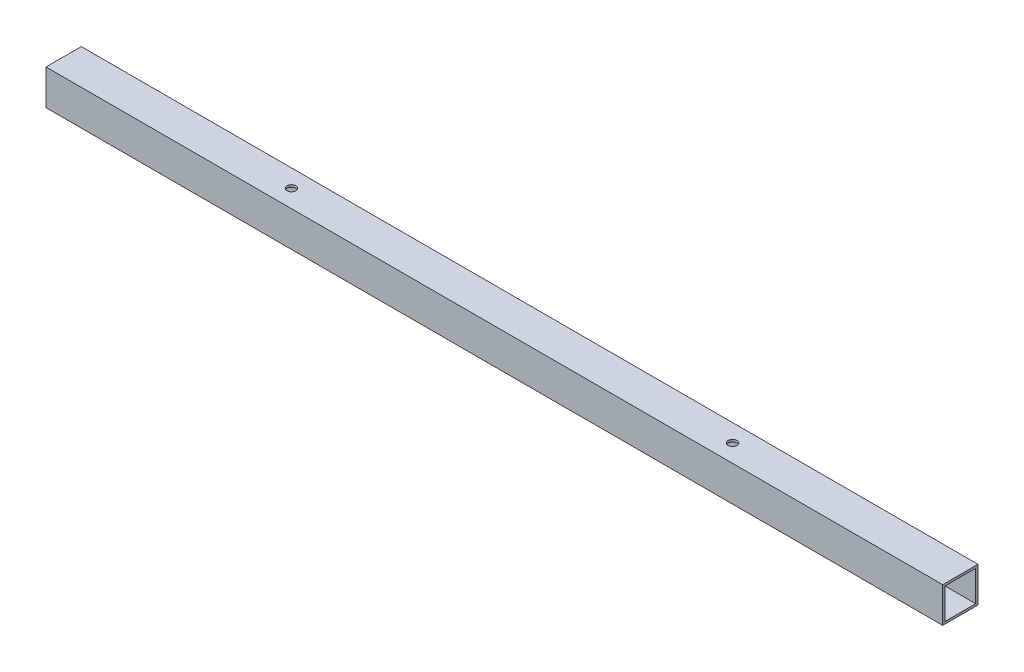
ISO-10303-21;
HEADER;
FILE_DESCRIPTION(('STEP AP214'),'2;1');
FILE_NAME('part.step','',(''),(''),'','','');
FILE_SCHEMA(('AUTOMOTIVE_DESIGN { 1 0 10303 214 1 1 1 1 }'));
ENDSEC;
DATA;
#1=APPLICATION_CONTEXT('core data for automotive mechanical design processes');
#2=APPLICATION_PROTOCOL_DEFINITION('international standard','automotive_design',2000,#1);
#3=PRODUCT_CONTEXT('',#1,'mechanical');
#4=PRODUCT('Part','Part','',(#3));
#5=PRODUCT_RELATED_PRODUCT_CATEGORY('part','',(#4));
#6=PRODUCT_DEFINITION_FORMATION('','',#4);
#7=PRODUCT_DEFINITION_CONTEXT('part definition',#1,'design');
#8=PRODUCT_DEFINITION('design','',#6,#7);
#9=PRODUCT_DEFINITION_SHAPE('','',#8);
#10=(LENGTH_UNIT() NAMED_UNIT(*) SI_UNIT(.MILLI.,.METRE.));
#11=(NAMED_UNIT(*) PLANE_ANGLE_UNIT() SI_UNIT($,.RADIAN.));
#12=(NAMED_UNIT(*) SI_UNIT($,.STERADIAN.) SOLID_ANGLE_UNIT());
#13=UNCERTAINTY_MEASURE_WITH_UNIT(LENGTH_MEASURE(1.E-05),#10,'distance_accuracy_value','');
#14=(GEOMETRIC_REPRESENTATION_CONTEXT(3) GLOBAL_UNCERTAINTY_ASSIGNED_CONTEXT((#13)) GLOBAL_UNIT_ASSIGNED_CONTEXT((#10,
#11,#12)) REPRESENTATION_CONTEXT('',''));
#15=CARTESIAN_POINT('',(0.,0.,0.));
#16=DIRECTION('',(0.,0.,1.));
#17=DIRECTION('',(1.,0.,0.));
#18=AXIS2_PLACEMENT_3D('',#15,#16,#17);
#19=CARTESIAN_POINT('',(645.4,12.7,-12.7));
#20=DIRECTION('',(0.,0.,1.));
#21=DIRECTION('',(1.,0.,0.));
#22=AXIS2_PLACEMENT_3D('',#19,#20,#21);
#23=PLANE('',#22);
#24=DIRECTION('',(0.,1.,0.));
#25=VECTOR('',#24,1.);
#26=CARTESIAN_POINT('',(0.,12.7,-12.7));
#27=LINE('',#26,#25);
#28=CARTESIAN_POINT('',(0.,-12.7,-12.7));
#29=VERTEX_POINT('',#28);
#30=CARTESIAN_POINT('',(0.,12.7,-12.7));
#31=VERTEX_POINT('',#30);
#32=EDGE_CURVE('E177',#29,#31,#27,.T.);
#33=ORIENTED_EDGE('',*,*,#32,.T.);
#34=DIRECTION('',(-1.,0.,0.));
#35=VECTOR('',#34,1.);
#36=CARTESIAN_POINT('',(645.4,12.7,-12.7));
#37=LINE('',#36,#35);
#38=CARTESIAN_POINT('',(645.4,12.7,-12.7));
#39=VERTEX_POINT('',#38);
#40=EDGE_CURVE('E12',#39,#31,#37,.T.);
#41=ORIENTED_EDGE('',*,*,#40,.F.);
#42=DIRECTION('',(0.,1.,0.));
#43=VECTOR('',#42,1.);
#44=CARTESIAN_POINT('',(645.4,12.7,-12.7));
#45=LINE('',#44,#43);
#46=CARTESIAN_POINT('',(645.4,-12.7,-12.7));
#47=VERTEX_POINT('',#46);
#48=EDGE_CURVE('E142',#47,#39,#45,.T.);
#49=ORIENTED_EDGE('',*,*,#48,.F.);
#50=DIRECTION('',(-1.,0.,0.));
#51=VECTOR('',#50,1.);
#52=CARTESIAN_POINT('',(645.4,-12.7,-12.7));
#53=LINE('',#52,#51);
#54=EDGE_CURVE('E188',#47,#29,#53,.T.);
#55=ORIENTED_EDGE('',*,*,#54,.T.);
#56=EDGE_LOOP('',(#33,#41,#49,#55));
#57=FACE_BOUND('',#56,.T.);
#58=ADVANCED_FACE('F60',(#57),#23,.F.);
#59=CARTESIAN_POINT('',(645.4,12.7,-12.7));
#60=DIRECTION('',(0.,-1.,0.));
#61=DIRECTION('',(0.,0.,-1.));
#62=AXIS2_PLACEMENT_3D('',#59,#60,#61);
#63=PLANE('',#62);
#64=CARTESIAN_POINT('',(163.95,12.7,0.));
#65=DIRECTION('',(0.,1.,0.));
#66=DIRECTION('',(0.,0.,1.));
#67=AXIS2_PLACEMENT_3D('',#64,#65,#66);
#68=CIRCLE('',#67,3.17499999999998);
#69=CARTESIAN_POINT('',(163.95,12.7,3.17499999999998));
#70=VERTEX_POINT('',#69);
#71=EDGE_CURVE('E259',#70,#70,#68,.T.);
#72=ORIENTED_EDGE('',*,*,#71,.F.);
#73=EDGE_LOOP('',(#72));
#74=FACE_BOUND('',#73,.T.);
#75=CARTESIAN_POINT('',(481.45,12.7,0.));
#76=DIRECTION('',(0.,1.,0.));
#77=DIRECTION('',(0.,0.,1.));
#78=AXIS2_PLACEMENT_3D('',#75,#76,#77);
#79=CIRCLE('',#78,3.17499999999998);
#80=CARTESIAN_POINT('',(481.45,12.7,3.17499999999994));
#81=VERTEX_POINT('',#80);
#82=EDGE_CURVE('E243',#81,#81,#79,.T.);
#83=ORIENTED_EDGE('',*,*,#82,.F.);
#84=EDGE_LOOP('',(#83));
#85=FACE_BOUND('',#84,.T.);
#86=DIRECTION('',(0.,0.,1.));
#87=VECTOR('',#86,1.);
#88=CARTESIAN_POINT('',(0.,12.7,-12.7));
#89=LINE('',#88,#87);
#90=CARTESIAN_POINT('',(0.,12.7,12.7));
#91=VERTEX_POINT('',#90);
#92=EDGE_CURVE('E148',#31,#91,#89,.T.);
#93=ORIENTED_EDGE('',*,*,#92,.T.);
#94=DIRECTION('',(-1.,0.,0.));
#95=VECTOR('',#94,1.);
#96=CARTESIAN_POINT('',(645.4,12.7,12.7));
#97=LINE('',#96,#95);
#98=CARTESIAN_POINT('',(645.4,12.7,12.7));
#99=VERTEX_POINT('',#98);
#100=EDGE_CURVE('E71',#99,#91,#97,.T.);
#101=ORIENTED_EDGE('',*,*,#100,.F.);
#102=DIRECTION('',(0.,0.,1.));
#103=VECTOR('',#102,1.);
#104=CARTESIAN_POINT('',(645.4,12.7,-12.7));
#105=LINE('',#104,#103);
#106=EDGE_CURVE('E136',#39,#99,#105,.T.);
#107=ORIENTED_EDGE('',*,*,#106,.F.);
#108=ORIENTED_EDGE('',*,*,#40,.T.);
#109=EDGE_LOOP('',(#93,#101,#107,#108));
#110=FACE_BOUND('',#109,.T.);
#111=ADVANCED_FACE('F147',(#74,#85,#110),#63,.F.);
#112=CARTESIAN_POINT('',(645.4,-12.7,12.7));
#113=DIRECTION('',(0.,0.,-1.));
#114=DIRECTION('',(0.,1.,0.));
#115=AXIS2_PLACEMENT_3D('',#112,#113,#114);
#116=PLANE('',#115);
#117=DIRECTION('',(0.,-1.,0.));
#118=VECTOR('',#117,1.);
#119=CARTESIAN_POINT('',(0.,-12.7,12.7));
#120=LINE('',#119,#118);
#121=CARTESIAN_POINT('',(0.,-12.7,12.7));
#122=VERTEX_POINT('',#121);
#123=EDGE_CURVE('E109',#91,#122,#120,.T.);
#124=ORIENTED_EDGE('',*,*,#123,.T.);
#125=DIRECTION('',(-1.,0.,0.));
#126=VECTOR('',#125,1.);
#127=CARTESIAN_POINT('',(645.4,-12.7,12.7));
#128=LINE('',#127,#126);
#129=CARTESIAN_POINT('',(645.4,-12.7,12.7));
#130=VERTEX_POINT('',#129);
#131=EDGE_CURVE('E150',#130,#122,#128,.T.);
#132=ORIENTED_EDGE('',*,*,#131,.F.);
#133=DIRECTION('',(0.,-1.,0.));
#134=VECTOR('',#133,1.);
#135=CARTESIAN_POINT('',(645.4,-12.7,12.7));
#136=LINE('',#135,#134);
#137=EDGE_CURVE('E140',#99,#130,#136,.T.);
#138=ORIENTED_EDGE('',*,*,#137,.F.);
#139=ORIENTED_EDGE('',*,*,#100,.T.);
#140=EDGE_LOOP('',(#124,#132,#138,#139));
#141=FACE_BOUND('',#140,.T.);
#142=ADVANCED_FACE('F152',(#141),#116,.F.);
#143=CARTESIAN_POINT('',(645.4,11.049,-11.049));
#144=DIRECTION('',(0.,-1.,0.));
#145=DIRECTION('',(0.,0.,-1.));
#146=AXIS2_PLACEMENT_3D('',#143,#144,#145);
#147=PLANE('',#146);
#148=CARTESIAN_POINT('',(163.95,11.049,0.));
#149=DIRECTION('',(0.,-1.,0.));
#150=DIRECTION('',(0.,0.,-1.));
#151=AXIS2_PLACEMENT_3D('',#148,#149,#150);
#152=CIRCLE('',#151,3.17499999999998);
#153=CARTESIAN_POINT('',(163.95,11.049,-3.17499999999998));
#154=VERTEX_POINT('',#153);
#155=EDGE_CURVE('E251',#154,#154,#152,.T.);
#156=ORIENTED_EDGE('',*,*,#155,.F.);
#157=EDGE_LOOP('',(#156));
#158=FACE_BOUND('',#157,.T.);
#159=CARTESIAN_POINT('',(481.45,11.049,0.));
#160=DIRECTION('',(0.,-1.,0.));
#161=DIRECTION('',(0.,0.,-1.));
#162=AXIS2_PLACEMENT_3D('',#159,#160,#161);
#163=CIRCLE('',#162,3.17499999999998);
#164=CARTESIAN_POINT('',(481.45,11.049,-3.17500000000002));
#165=VERTEX_POINT('',#164);
#166=EDGE_CURVE('E235',#165,#165,#163,.T.);
#167=ORIENTED_EDGE('',*,*,#166,.F.);
#168=EDGE_LOOP('',(#167));
#169=FACE_BOUND('',#168,.T.);
#170=DIRECTION('',(0.,0.,1.));
#171=VECTOR('',#170,1.);
#172=CARTESIAN_POINT('',(0.,11.049,-11.049));
#173=LINE('',#172,#171);
#174=CARTESIAN_POINT('',(0.,11.049,-11.049));
#175=VERTEX_POINT('',#174);
#176=CARTESIAN_POINT('',(0.,11.049,11.049));
#177=VERTEX_POINT('',#176);
#178=EDGE_CURVE('E160',#175,#177,#173,.T.);
#179=ORIENTED_EDGE('',*,*,#178,.F.);
#180=DIRECTION('',(-1.,0.,0.));
#181=VECTOR('',#180,1.);
#182=CARTESIAN_POINT('',(645.4,11.049,-11.049));
#183=LINE('',#182,#181);
#184=CARTESIAN_POINT('',(645.4,11.049,-11.049));
#185=VERTEX_POINT('',#184);
#186=EDGE_CURVE('E64',#185,#175,#183,.T.);
#187=ORIENTED_EDGE('',*,*,#186,.F.);
#188=DIRECTION('',(0.,0.,1.));
#189=VECTOR('',#188,1.);
#190=CARTESIAN_POINT('',(645.4,11.049,-11.049));
#191=LINE('',#190,#189);
#192=CARTESIAN_POINT('',(645.4,11.049,11.049));
#193=VERTEX_POINT('',#192);
#194=EDGE_CURVE('E187',#185,#193,#191,.T.);
#195=ORIENTED_EDGE('',*,*,#194,.T.);
#196=DIRECTION('',(-1.,0.,0.));
#197=VECTOR('',#196,1.);
#198=CARTESIAN_POINT('',(645.4,11.049,11.049));
#199=LINE('',#198,#197);
#200=EDGE_CURVE('E156',#193,#177,#199,.T.);
#201=ORIENTED_EDGE('',*,*,#200,.T.);
#202=EDGE_LOOP('',(#179,#187,#195,#201));
#203=FACE_BOUND('',#202,.T.);
#204=ADVANCED_FACE('F62',(#158,#169,#203),#147,.T.);
#205=CARTESIAN_POINT('',(645.4,11.049,-11.049));
#206=DIRECTION('',(0.,0.,1.));
#207=DIRECTION('',(1.,0.,0.));
#208=AXIS2_PLACEMENT_3D('',#205,#206,#207);
#209=PLANE('',#208);
#210=DIRECTION('',(0.,1.,0.));
#211=VECTOR('',#210,1.);
#212=CARTESIAN_POINT('',(0.,11.049,-11.049));
#213=LINE('',#212,#211);
#214=CARTESIAN_POINT('',(0.,-11.049,-11.049));
#215=VERTEX_POINT('',#214);
#216=EDGE_CURVE('E164',#215,#175,#213,.T.);
#217=ORIENTED_EDGE('',*,*,#216,.F.);
#218=DIRECTION('',(-1.,0.,0.));
#219=VECTOR('',#218,1.);
#220=CARTESIAN_POINT('',(645.4,-11.049,-11.049));
#221=LINE('',#220,#219);
#222=CARTESIAN_POINT('',(645.4,-11.049,-11.049));
#223=VERTEX_POINT('',#222);
#224=EDGE_CURVE('E197',#223,#215,#221,.T.);
#225=ORIENTED_EDGE('',*,*,#224,.F.);
#226=DIRECTION('',(0.,1.,0.));
#227=VECTOR('',#226,1.);
#228=CARTESIAN_POINT('',(645.4,11.049,-11.049));
#229=LINE('',#228,#227);
#230=EDGE_CURVE('E208',#223,#185,#229,.T.);
#231=ORIENTED_EDGE('',*,*,#230,.T.);
#232=ORIENTED_EDGE('',*,*,#186,.T.);
#233=EDGE_LOOP('',(#217,#225,#231,#232));
#234=FACE_BOUND('',#233,.T.);
#235=ADVANCED_FACE('F206',(#234),#209,.T.);
#236=CARTESIAN_POINT('',(645.4,-11.049,11.049));
#237=DIRECTION('',(0.,1.,0.));
#238=DIRECTION('',(0.,0.,1.));
#239=AXIS2_PLACEMENT_3D('',#236,#237,#238);
#240=PLANE('',#239);
#241=CARTESIAN_POINT('',(163.95,-11.049,0.));
#242=DIRECTION('',(0.,1.,0.));
#243=DIRECTION('',(0.,0.,1.));
#244=AXIS2_PLACEMENT_3D('',#241,#242,#243);
#245=CIRCLE('',#244,3.17499999999998);
#246=CARTESIAN_POINT('',(163.95,-11.049,3.17499999999998));
#247=VERTEX_POINT('',#246);
#248=EDGE_CURVE('E247',#247,#247,#245,.T.);
#249=ORIENTED_EDGE('',*,*,#248,.F.);
#250=EDGE_LOOP('',(#249));
#251=FACE_BOUND('',#250,.T.);
#252=CARTESIAN_POINT('',(481.45,-11.049,0.));
#253=DIRECTION('',(0.,1.,0.));
#254=DIRECTION('',(0.,0.,1.));
#255=AXIS2_PLACEMENT_3D('',#252,#253,#254);
#256=CIRCLE('',#255,3.17499999999998);
#257=CARTESIAN_POINT('',(481.45,-11.049,3.17499999999994));
#258=VERTEX_POINT('',#257);
#259=EDGE_CURVE('E165',#258,#258,#256,.T.);
#260=ORIENTED_EDGE('',*,*,#259,.F.);
#261=EDGE_LOOP('',(#260));
#262=FACE_BOUND('',#261,.T.);
#263=DIRECTION('',(0.,0.,-1.));
#264=VECTOR('',#263,1.);
#265=CARTESIAN_POINT('',(0.,-11.049,11.049));
#266=LINE('',#265,#264);
#267=CARTESIAN_POINT('',(0.,-11.049,11.049));
#268=VERTEX_POINT('',#267);
#269=EDGE_CURVE('E169',#268,#215,#266,.T.);
#270=ORIENTED_EDGE('',*,*,#269,.F.);
#271=DIRECTION('',(-1.,0.,0.));
#272=VECTOR('',#271,1.);
#273=CARTESIAN_POINT('',(645.4,-11.049,11.049));
#274=LINE('',#273,#272);
#275=CARTESIAN_POINT('',(645.4,-11.049,11.049));
#276=VERTEX_POINT('',#275);
#277=EDGE_CURVE('E195',#276,#268,#274,.T.);
#278=ORIENTED_EDGE('',*,*,#277,.F.);
#279=DIRECTION('',(0.,0.,-1.));
#280=VECTOR('',#279,1.);
#281=CARTESIAN_POINT('',(645.4,-11.049,11.049));
#282=LINE('',#281,#280);
#283=EDGE_CURVE('E215',#276,#223,#282,.T.);
#284=ORIENTED_EDGE('',*,*,#283,.T.);
#285=ORIENTED_EDGE('',*,*,#224,.T.);
#286=EDGE_LOOP('',(#270,#278,#284,#285));
#287=FACE_BOUND('',#286,.T.);
#288=ADVANCED_FACE('F213',(#251,#262,#287),#240,.T.);
#289=CARTESIAN_POINT('',(645.4,-11.049,11.049));
#290=DIRECTION('',(0.,0.,-1.));
#291=DIRECTION('',(-1.,0.,0.));
#292=AXIS2_PLACEMENT_3D('',#289,#290,#291);
#293=PLANE('',#292);
#294=DIRECTION('',(0.,-1.,0.));
#295=VECTOR('',#294,1.);
#296=CARTESIAN_POINT('',(0.,-11.049,11.049));
#297=LINE('',#296,#295);
#298=EDGE_CURVE('E173',#177,#268,#297,.T.);
#299=ORIENTED_EDGE('',*,*,#298,.F.);
#300=ORIENTED_EDGE('',*,*,#200,.F.);
#301=DIRECTION('',(0.,-1.,0.));
#302=VECTOR('',#301,1.);
#303=CARTESIAN_POINT('',(645.4,-11.049,11.049));
#304=LINE('',#303,#302);
#305=EDGE_CURVE('E220',#193,#276,#304,.T.);
#306=ORIENTED_EDGE('',*,*,#305,.T.);
#307=ORIENTED_EDGE('',*,*,#277,.T.);
#308=EDGE_LOOP('',(#299,#300,#306,#307));
#309=FACE_BOUND('',#308,.T.);
#310=ADVANCED_FACE('F223',(#309),#293,.T.);
#311=CARTESIAN_POINT('',(645.4,-12.7,12.7));
#312=DIRECTION('',(0.,1.,0.));
#313=DIRECTION('',(0.,0.,1.));
#314=AXIS2_PLACEMENT_3D('',#311,#312,#313);
#315=PLANE('',#314);
#316=CARTESIAN_POINT('',(163.95,-12.7,0.));
#317=DIRECTION('',(0.,1.,0.));
#318=DIRECTION('',(0.,0.,1.));
#319=AXIS2_PLACEMENT_3D('',#316,#317,#318);
#320=CIRCLE('',#319,3.17499999999998);
#321=CARTESIAN_POINT('',(163.95,-12.7,3.17499999999998));
#322=VERTEX_POINT('',#321);
#323=EDGE_CURVE('E255',#322,#322,#320,.T.);
#324=ORIENTED_EDGE('',*,*,#323,.T.);
#325=EDGE_LOOP('',(#324));
#326=FACE_BOUND('',#325,.T.);
#327=CARTESIAN_POINT('',(481.45,-12.7,0.));
#328=DIRECTION('',(0.,1.,0.));
#329=DIRECTION('',(0.,0.,1.));
#330=AXIS2_PLACEMENT_3D('',#327,#328,#329);
#331=CIRCLE('',#330,3.17499999999998);
#332=CARTESIAN_POINT('',(481.45,-12.7,3.17499999999994));
#333=VERTEX_POINT('',#332);
#334=EDGE_CURVE('E239',#333,#333,#331,.T.);
#335=ORIENTED_EDGE('',*,*,#334,.T.);
#336=EDGE_LOOP('',(#335));
#337=FACE_BOUND('',#336,.T.);
#338=DIRECTION('',(0.,0.,-1.));
#339=VECTOR('',#338,1.);
#340=CARTESIAN_POINT('',(0.,-12.7,12.7));
#341=LINE('',#340,#339);
#342=EDGE_CURVE('E115',#122,#29,#341,.T.);
#343=ORIENTED_EDGE('',*,*,#342,.T.);
#344=ORIENTED_EDGE('',*,*,#54,.F.);
#345=DIRECTION('',(0.,0.,-1.));
#346=VECTOR('',#345,1.);
#347=CARTESIAN_POINT('',(645.4,-12.7,12.7));
#348=LINE('',#347,#346);
#349=EDGE_CURVE('E80',#130,#47,#348,.T.);
#350=ORIENTED_EDGE('',*,*,#349,.F.);
#351=ORIENTED_EDGE('',*,*,#131,.T.);
#352=EDGE_LOOP('',(#343,#344,#350,#351));
#353=FACE_BOUND('',#352,.T.);
#354=ADVANCED_FACE('F295',(#326,#337,#353),#315,.F.);
#355=CARTESIAN_POINT('',(645.4,0.,0.));
#356=DIRECTION('',(1.,0.,0.));
#357=DIRECTION('',(0.,0.,-1.));
#358=AXIS2_PLACEMENT_3D('',#355,#356,#357);
#359=PLANE('',#358);
#360=ORIENTED_EDGE('',*,*,#194,.F.);
#361=ORIENTED_EDGE('',*,*,#230,.F.);
#362=ORIENTED_EDGE('',*,*,#283,.F.);
#363=ORIENTED_EDGE('',*,*,#305,.F.);
#364=EDGE_LOOP('',(#360,#361,#362,#363));
#365=FACE_BOUND('',#364,.T.);
#366=ORIENTED_EDGE('',*,*,#48,.T.);
#367=ORIENTED_EDGE('',*,*,#106,.T.);
#368=ORIENTED_EDGE('',*,*,#137,.T.);
#369=ORIENTED_EDGE('',*,*,#349,.T.);
#370=EDGE_LOOP('',(#366,#367,#368,#369));
#371=FACE_BOUND('',#370,.T.);
#372=ADVANCED_FACE('F138',(#365,#371),#359,.T.);
#373=CARTESIAN_POINT('',(0.,0.,0.));
#374=DIRECTION('',(1.,0.,0.));
#375=DIRECTION('',(0.,0.,-1.));
#376=AXIS2_PLACEMENT_3D('',#373,#374,#375);
#377=PLANE('',#376);
#378=ORIENTED_EDGE('',*,*,#178,.T.);
#379=ORIENTED_EDGE('',*,*,#298,.T.);
#380=ORIENTED_EDGE('',*,*,#269,.T.);
#381=ORIENTED_EDGE('',*,*,#216,.T.);
#382=EDGE_LOOP('',(#378,#379,#380,#381));
#383=FACE_BOUND('',#382,.T.);
#384=ORIENTED_EDGE('',*,*,#32,.F.);
#385=ORIENTED_EDGE('',*,*,#342,.F.);
#386=ORIENTED_EDGE('',*,*,#123,.F.);
#387=ORIENTED_EDGE('',*,*,#92,.F.);
#388=EDGE_LOOP('',(#384,#385,#386,#387));
#389=FACE_BOUND('',#388,.T.);
#390=ADVANCED_FACE('F211',(#383,#389),#377,.F.);
#391=CARTESIAN_POINT('',(481.45,12.7,0.));
#392=DIRECTION('',(0.,1.,0.));
#393=DIRECTION('',(0.,0.,1.));
#394=AXIS2_PLACEMENT_3D('',#391,#392,#393);
#395=CYLINDRICAL_SURFACE('',#394,3.17499999999998);
#396=ORIENTED_EDGE('',*,*,#259,.T.);
#397=EDGE_LOOP('',(#396));
#398=FACE_BOUND('',#397,.T.);
#399=ORIENTED_EDGE('',*,*,#334,.F.);
#400=EDGE_LOOP('',(#399));
#401=FACE_BOUND('',#400,.T.);
#402=ADVANCED_FACE('F274',(#398,#401),#395,.F.);
#403=ORIENTED_EDGE('',*,*,#166,.T.);
#404=EDGE_LOOP('',(#403));
#405=FACE_BOUND('',#404,.T.);
#406=ORIENTED_EDGE('',*,*,#82,.T.);
#407=EDGE_LOOP('',(#406));
#408=FACE_BOUND('',#407,.T.);
#409=ADVANCED_FACE('F271',(#405,#408),#395,.F.);
#410=CARTESIAN_POINT('',(163.95,12.7,0.));
#411=DIRECTION('',(0.,1.,0.));
#412=DIRECTION('',(0.,0.,1.));
#413=AXIS2_PLACEMENT_3D('',#410,#411,#412);
#414=CYLINDRICAL_SURFACE('',#413,3.17499999999998);
#415=ORIENTED_EDGE('',*,*,#248,.T.);
#416=EDGE_LOOP('',(#415));
#417=FACE_BOUND('',#416,.T.);
#418=ORIENTED_EDGE('',*,*,#323,.F.);
#419=EDGE_LOOP('',(#418));
#420=FACE_BOUND('',#419,.T.);
#421=ADVANCED_FACE('F273',(#417,#420),#414,.F.);
#422=ORIENTED_EDGE('',*,*,#155,.T.);
#423=EDGE_LOOP('',(#422));
#424=FACE_BOUND('',#423,.T.);
#425=ORIENTED_EDGE('',*,*,#71,.T.);
#426=EDGE_LOOP('',(#425));
#427=FACE_BOUND('',#426,.T.);
#428=ADVANCED_FACE('F264',(#424,#427),#414,.F.);
#429=CLOSED_SHELL('',(#58,#111,#142,#204,#235,#288,#310,#354,#372,#390,#402,#409,#421,#428));
#430=MANIFOLD_SOLID_BREP('B2',#429);
#431=ADVANCED_BREP_SHAPE_REPRESENTATION('',(#18,#430),#14);
#432=SHAPE_DEFINITION_REPRESENTATION(#9,#431);
ENDSEC;
END-ISO-10303-21;
